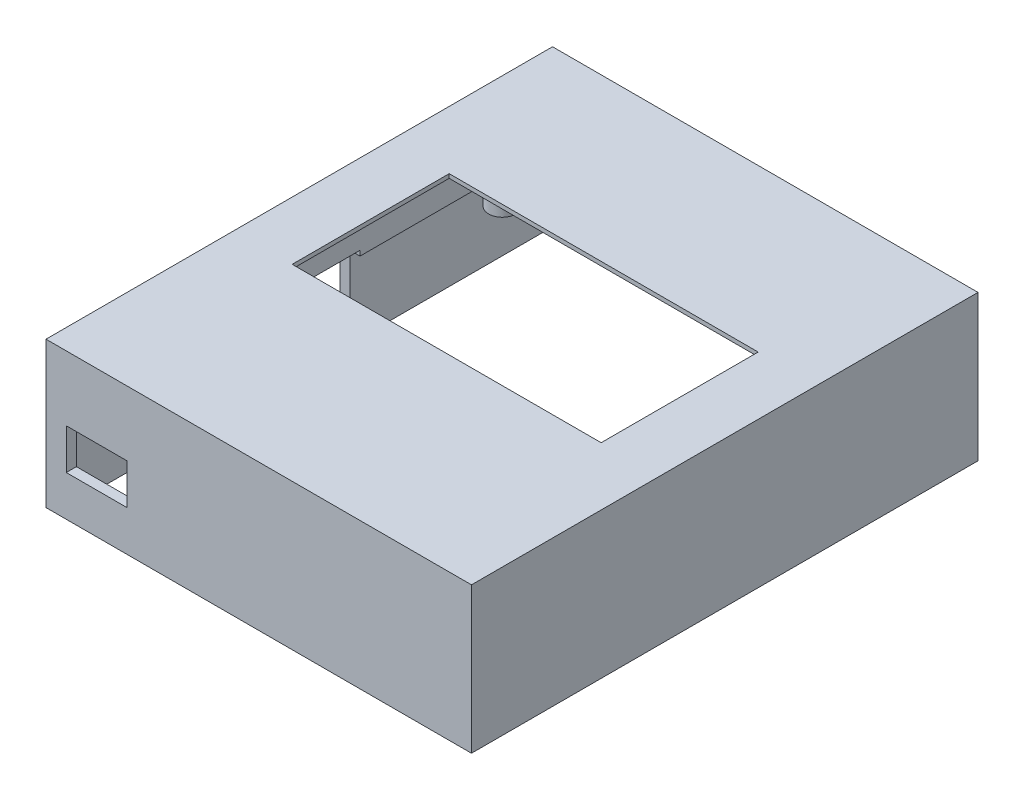
ISO-10303-21;
HEADER;
FILE_DESCRIPTION(('STEP AP214'),'2;1');
FILE_NAME('part.step','',(''),(''),'','','');
FILE_SCHEMA(('AUTOMOTIVE_DESIGN { 1 0 10303 214 1 1 1 1 }'));
ENDSEC;
DATA;
#1=APPLICATION_CONTEXT('core data for automotive mechanical design processes');
#2=APPLICATION_PROTOCOL_DEFINITION('international standard','automotive_design',2000,#1);
#3=PRODUCT_CONTEXT('',#1,'mechanical');
#4=PRODUCT('Part','Part','',(#3));
#5=PRODUCT_RELATED_PRODUCT_CATEGORY('part','',(#4));
#6=PRODUCT_DEFINITION_FORMATION('','',#4);
#7=PRODUCT_DEFINITION_CONTEXT('part definition',#1,'design');
#8=PRODUCT_DEFINITION('design','',#6,#7);
#9=PRODUCT_DEFINITION_SHAPE('','',#8);
#10=(LENGTH_UNIT() NAMED_UNIT(*) SI_UNIT(.MILLI.,.METRE.));
#11=(NAMED_UNIT(*) PLANE_ANGLE_UNIT() SI_UNIT($,.RADIAN.));
#12=(NAMED_UNIT(*) SI_UNIT($,.STERADIAN.) SOLID_ANGLE_UNIT());
#13=UNCERTAINTY_MEASURE_WITH_UNIT(LENGTH_MEASURE(1.E-05),#10,'distance_accuracy_value','');
#14=(GEOMETRIC_REPRESENTATION_CONTEXT(3) GLOBAL_UNCERTAINTY_ASSIGNED_CONTEXT((#13)) GLOBAL_UNIT_ASSIGNED_CONTEXT((#10,
#11,#12)) REPRESENTATION_CONTEXT('',''));
#15=CARTESIAN_POINT('',(0.,0.,0.));
#16=DIRECTION('',(0.,0.,1.));
#17=DIRECTION('',(1.,0.,0.));
#18=AXIS2_PLACEMENT_3D('',#15,#16,#17);
#19=CARTESIAN_POINT('',(0.,-6.,0.));
#20=DIRECTION('',(0.,-1.,0.));
#21=DIRECTION('',(0.,0.,-1.));
#22=AXIS2_PLACEMENT_3D('',#19,#20,#21);
#23=PLANE('',#22);
#24=DIRECTION('',(-1.,0.,0.));
#25=VECTOR('',#24,1.);
#26=CARTESIAN_POINT('',(21.001,-6.,-4.00000000000001));
#27=LINE('',#26,#25);
#28=CARTESIAN_POINT('',(-19.,-6.,-4.));
#29=VERTEX_POINT('',#28);
#30=CARTESIAN_POINT('',(-20.,-6.,-4.));
#31=VERTEX_POINT('',#30);
#32=EDGE_CURVE('E235',#29,#31,#27,.T.);
#33=ORIENTED_EDGE('',*,*,#32,.T.);
#34=DIRECTION('',(0.,0.,-1.));
#35=VECTOR('',#34,1.);
#36=CARTESIAN_POINT('',(-20.,-6.,18.1));
#37=LINE('',#36,#35);
#38=CARTESIAN_POINT('',(-20.,-6.,-24.));
#39=VERTEX_POINT('',#38);
#40=EDGE_CURVE('E315',#31,#39,#37,.T.);
#41=ORIENTED_EDGE('',*,*,#40,.T.);
#42=DIRECTION('',(1.,0.,0.));
#43=VECTOR('',#42,1.);
#44=CARTESIAN_POINT('',(-20.,-6.,-24.));
#45=LINE('',#44,#43);
#46=CARTESIAN_POINT('',(-19.,-6.,-24.));
#47=VERTEX_POINT('',#46);
#48=EDGE_CURVE('E314',#39,#47,#45,.T.);
#49=ORIENTED_EDGE('',*,*,#48,.T.);
#50=DIRECTION('',(0.,0.,1.));
#51=VECTOR('',#50,1.);
#52=CARTESIAN_POINT('',(-19.,-6.,18.1));
#53=LINE('',#52,#51);
#54=EDGE_CURVE('E319',#47,#29,#53,.T.);
#55=ORIENTED_EDGE('',*,*,#54,.T.);
#56=EDGE_LOOP('',(#33,#41,#49,#55));
#57=FACE_BOUND('',#56,.T.);
#58=ADVANCED_FACE('F39',(#57),#23,.T.);
#59=CARTESIAN_POINT('',(0.,0.,0.));
#60=DIRECTION('',(0.,1.,0.));
#61=DIRECTION('',(0.,0.,1.));
#62=AXIS2_PLACEMENT_3D('',#59,#60,#61);
#63=PLANE('',#62);
#64=DIRECTION('',(-1.,0.,0.));
#65=VECTOR('',#64,1.);
#66=CARTESIAN_POINT('',(-15.25,0.,6.45));
#67=LINE('',#66,#65);
#68=CARTESIAN_POINT('',(15.25,0.,6.45));
#69=VERTEX_POINT('',#68);
#70=CARTESIAN_POINT('',(-15.25,0.,6.45));
#71=VERTEX_POINT('',#70);
#72=EDGE_CURVE('E381',#69,#71,#67,.T.);
#73=ORIENTED_EDGE('',*,*,#72,.F.);
#74=DIRECTION('',(0.,0.,1.));
#75=VECTOR('',#74,1.);
#76=CARTESIAN_POINT('',(15.25,0.,-9.05));
#77=LINE('',#76,#75);
#78=CARTESIAN_POINT('',(15.25,0.,-9.05));
#79=VERTEX_POINT('',#78);
#80=EDGE_CURVE('E384',#79,#69,#77,.T.);
#81=ORIENTED_EDGE('',*,*,#80,.F.);
#82=DIRECTION('',(1.,0.,0.));
#83=VECTOR('',#82,1.);
#84=CARTESIAN_POINT('',(-15.25,0.,-9.05));
#85=LINE('',#84,#83);
#86=CARTESIAN_POINT('',(-15.25,0.,-9.05));
#87=VERTEX_POINT('',#86);
#88=EDGE_CURVE('E401',#87,#79,#85,.T.);
#89=ORIENTED_EDGE('',*,*,#88,.F.);
#90=DIRECTION('',(0.,0.,-1.));
#91=VECTOR('',#90,1.);
#92=CARTESIAN_POINT('',(-15.25,0.,-9.05));
#93=LINE('',#92,#91);
#94=EDGE_CURVE('E379',#71,#87,#93,.T.);
#95=ORIENTED_EDGE('',*,*,#94,.F.);
#96=EDGE_LOOP('',(#73,#81,#89,#95));
#97=FACE_BOUND('',#96,.T.);
#98=CARTESIAN_POINT('',(-15.25,0.,-14.3));
#99=DIRECTION('',(0.,1.,0.));
#100=DIRECTION('',(0.,0.,1.));
#101=AXIS2_PLACEMENT_3D('',#98,#99,#100);
#102=CIRCLE('',#101,1.35);
#103=CARTESIAN_POINT('',(-15.25,0.,-12.95));
#104=VERTEX_POINT('',#103);
#105=EDGE_CURVE('E11',#104,#104,#102,.F.);
#106=ORIENTED_EDGE('',*,*,#105,.F.);
#107=EDGE_LOOP('',(#106));
#108=FACE_BOUND('',#107,.T.);
#109=CARTESIAN_POINT('',(15.25,0.,14.3));
#110=DIRECTION('',(0.,1.,0.));
#111=DIRECTION('',(0.,0.,1.));
#112=AXIS2_PLACEMENT_3D('',#109,#110,#111);
#113=CIRCLE('',#112,1.35);
#114=CARTESIAN_POINT('',(15.25,0.,15.65));
#115=VERTEX_POINT('',#114);
#116=EDGE_CURVE('E47',#115,#115,#113,.F.);
#117=ORIENTED_EDGE('',*,*,#116,.F.);
#118=EDGE_LOOP('',(#117));
#119=FACE_BOUND('',#118,.T.);
#120=DIRECTION('',(0.,0.,-1.));
#121=VECTOR('',#120,1.);
#122=CARTESIAN_POINT('',(19.,0.,24.));
#123=LINE('',#122,#121);
#124=CARTESIAN_POINT('',(19.,0.,24.));
#125=VERTEX_POINT('',#124);
#126=CARTESIAN_POINT('',(19.,0.,-24.));
#127=VERTEX_POINT('',#126);
#128=EDGE_CURVE('E257',#125,#127,#123,.T.);
#129=ORIENTED_EDGE('',*,*,#128,.F.);
#130=DIRECTION('',(-1.,0.,0.));
#131=VECTOR('',#130,1.);
#132=CARTESIAN_POINT('',(20.,0.,24.));
#133=LINE('',#132,#131);
#134=CARTESIAN_POINT('',(-20.,0.,24.));
#135=VERTEX_POINT('',#134);
#136=EDGE_CURVE('E338',#125,#135,#133,.T.);
#137=ORIENTED_EDGE('',*,*,#136,.T.);
#138=DIRECTION('',(0.,0.,-1.));
#139=VECTOR('',#138,1.);
#140=CARTESIAN_POINT('',(-20.,0.,24.));
#141=LINE('',#140,#139);
#142=CARTESIAN_POINT('',(-20.,0.,18.1));
#143=VERTEX_POINT('',#142);
#144=EDGE_CURVE('E351',#135,#143,#141,.T.);
#145=ORIENTED_EDGE('',*,*,#144,.T.);
#146=DIRECTION('',(-1.,0.,0.));
#147=VECTOR('',#146,1.);
#148=CARTESIAN_POINT('',(-20.,0.,18.1));
#149=LINE('',#148,#147);
#150=CARTESIAN_POINT('',(-19.,0.,18.1));
#151=VERTEX_POINT('',#150);
#152=EDGE_CURVE('E328',#151,#143,#149,.T.);
#153=ORIENTED_EDGE('',*,*,#152,.F.);
#154=DIRECTION('',(0.,0.,1.));
#155=VECTOR('',#154,1.);
#156=CARTESIAN_POINT('',(-19.,0.,18.1));
#157=LINE('',#156,#155);
#158=CARTESIAN_POINT('',(-19.,0.,-24.));
#159=VERTEX_POINT('',#158);
#160=EDGE_CURVE('E310',#159,#151,#157,.T.);
#161=ORIENTED_EDGE('',*,*,#160,.F.);
#162=DIRECTION('',(1.,0.,0.));
#163=VECTOR('',#162,1.);
#164=CARTESIAN_POINT('',(-20.,0.,-24.));
#165=LINE('',#164,#163);
#166=EDGE_CURVE('E342',#159,#127,#165,.T.);
#167=ORIENTED_EDGE('',*,*,#166,.T.);
#168=EDGE_LOOP('',(#129,#137,#145,#153,#161,#167));
#169=FACE_BOUND('',#168,.T.);
#170=ADVANCED_FACE('F437',(#97,#108,#119,#169),#63,.F.);
#171=CARTESIAN_POINT('',(-20.,-14.,-24.));
#172=DIRECTION('',(0.,0.,1.));
#173=DIRECTION('',(1.,0.,0.));
#174=AXIS2_PLACEMENT_3D('',#171,#172,#173);
#175=PLANE('',#174);
#176=DIRECTION('',(1.,0.,0.));
#177=VECTOR('',#176,1.);
#178=CARTESIAN_POINT('',(20.,-6.,-24.));
#179=LINE('',#178,#177);
#180=CARTESIAN_POINT('',(19.,-6.,-24.));
#181=VERTEX_POINT('',#180);
#182=CARTESIAN_POINT('',(20.,-6.,-24.));
#183=VERTEX_POINT('',#182);
#184=EDGE_CURVE('E302',#181,#183,#179,.T.);
#185=ORIENTED_EDGE('',*,*,#184,.F.);
#186=DIRECTION('',(0.,1.,0.));
#187=VECTOR('',#186,1.);
#188=CARTESIAN_POINT('',(19.,-6.,-24.));
#189=LINE('',#188,#187);
#190=EDGE_CURVE('E304',#181,#127,#189,.T.);
#191=ORIENTED_EDGE('',*,*,#190,.T.);
#192=ORIENTED_EDGE('',*,*,#166,.F.);
#193=DIRECTION('',(0.,1.,0.));
#194=VECTOR('',#193,1.);
#195=CARTESIAN_POINT('',(-19.,-6.,-24.));
#196=LINE('',#195,#194);
#197=EDGE_CURVE('E335',#47,#159,#196,.T.);
#198=ORIENTED_EDGE('',*,*,#197,.F.);
#199=ORIENTED_EDGE('',*,*,#48,.F.);
#200=DIRECTION('',(0.,1.,0.));
#201=VECTOR('',#200,1.);
#202=CARTESIAN_POINT('',(-20.,-14.,-24.));
#203=LINE('',#202,#201);
#204=CARTESIAN_POINT('',(-20.,-14.,-24.));
#205=VERTEX_POINT('',#204);
#206=EDGE_CURVE('E358',#205,#39,#203,.T.);
#207=ORIENTED_EDGE('',*,*,#206,.F.);
#208=DIRECTION('',(1.,0.,0.));
#209=VECTOR('',#208,1.);
#210=CARTESIAN_POINT('',(-20.,-14.,-24.));
#211=LINE('',#210,#209);
#212=CARTESIAN_POINT('',(20.,-14.,-24.));
#213=VERTEX_POINT('',#212);
#214=EDGE_CURVE('E347',#205,#213,#211,.T.);
#215=ORIENTED_EDGE('',*,*,#214,.T.);
#216=DIRECTION('',(0.,1.,0.));
#217=VECTOR('',#216,1.);
#218=CARTESIAN_POINT('',(20.,-14.,-24.));
#219=LINE('',#218,#217);
#220=EDGE_CURVE('E349',#213,#183,#219,.T.);
#221=ORIENTED_EDGE('',*,*,#220,.T.);
#222=EDGE_LOOP('',(#185,#191,#192,#198,#199,#207,#215,#221));
#223=FACE_BOUND('',#222,.T.);
#224=ADVANCED_FACE('F440',(#223),#175,.T.);
#225=CARTESIAN_POINT('',(20.,-14.,-24.));
#226=DIRECTION('',(-1.,0.,0.));
#227=DIRECTION('',(0.,0.,1.));
#228=AXIS2_PLACEMENT_3D('',#225,#226,#227);
#229=PLANE('',#228);
#230=DIRECTION('',(0.,1.,0.));
#231=VECTOR('',#230,1.);
#232=CARTESIAN_POINT('',(20.,-14.,24.));
#233=LINE('',#232,#231);
#234=CARTESIAN_POINT('',(20.,-14.,24.));
#235=VERTEX_POINT('',#234);
#236=CARTESIAN_POINT('',(20.,-6.,24.));
#237=VERTEX_POINT('',#236);
#238=EDGE_CURVE('E364',#235,#237,#233,.T.);
#239=ORIENTED_EDGE('',*,*,#238,.T.);
#240=DIRECTION('',(0.,0.,1.));
#241=VECTOR('',#240,1.);
#242=CARTESIAN_POINT('',(20.,-6.,24.));
#243=LINE('',#242,#241);
#244=EDGE_CURVE('E296',#183,#237,#243,.T.);
#245=ORIENTED_EDGE('',*,*,#244,.F.);
#246=ORIENTED_EDGE('',*,*,#220,.F.);
#247=DIRECTION('',(0.,0.,1.));
#248=VECTOR('',#247,1.);
#249=CARTESIAN_POINT('',(20.,-14.,-24.));
#250=LINE('',#249,#248);
#251=EDGE_CURVE('E339',#213,#235,#250,.T.);
#252=ORIENTED_EDGE('',*,*,#251,.T.);
#253=EDGE_LOOP('',(#239,#245,#246,#252));
#254=FACE_BOUND('',#253,.T.);
#255=ADVANCED_FACE('F479',(#254),#229,.T.);
#256=CARTESIAN_POINT('',(20.,-14.,24.));
#257=DIRECTION('',(0.,0.,-1.));
#258=DIRECTION('',(-1.,0.,0.));
#259=AXIS2_PLACEMENT_3D('',#256,#257,#258);
#260=PLANE('',#259);
#261=DIRECTION('',(0.,-1.,0.));
#262=VECTOR('',#261,1.);
#263=CARTESIAN_POINT('',(-19.,-10.,24.));
#264=LINE('',#263,#262);
#265=CARTESIAN_POINT('',(-19.,-6.,24.));
#266=VERTEX_POINT('',#265);
#267=CARTESIAN_POINT('',(-19.,-10.,24.));
#268=VERTEX_POINT('',#267);
#269=EDGE_CURVE('E221',#266,#268,#264,.T.);
#270=ORIENTED_EDGE('',*,*,#269,.T.);
#271=DIRECTION('',(1.,0.,0.));
#272=VECTOR('',#271,1.);
#273=CARTESIAN_POINT('',(-13.,-10.,24.));
#274=LINE('',#273,#272);
#275=CARTESIAN_POINT('',(-13.,-10.,24.));
#276=VERTEX_POINT('',#275);
#277=EDGE_CURVE('E244',#268,#276,#274,.T.);
#278=ORIENTED_EDGE('',*,*,#277,.T.);
#279=DIRECTION('',(0.,1.,0.));
#280=VECTOR('',#279,1.);
#281=CARTESIAN_POINT('',(-13.,-10.,24.));
#282=LINE('',#281,#280);
#283=CARTESIAN_POINT('',(-13.,-6.,24.));
#284=VERTEX_POINT('',#283);
#285=EDGE_CURVE('E224',#276,#284,#282,.T.);
#286=ORIENTED_EDGE('',*,*,#285,.T.);
#287=DIRECTION('',(-1.,0.,0.));
#288=VECTOR('',#287,1.);
#289=CARTESIAN_POINT('',(-13.,-6.,24.));
#290=LINE('',#289,#288);
#291=EDGE_CURVE('E225',#284,#266,#290,.T.);
#292=ORIENTED_EDGE('',*,*,#291,.T.);
#293=EDGE_LOOP('',(#270,#278,#286,#292));
#294=FACE_BOUND('',#293,.T.);
#295=ORIENTED_EDGE('',*,*,#136,.F.);
#296=DIRECTION('',(0.,1.,0.));
#297=VECTOR('',#296,1.);
#298=CARTESIAN_POINT('',(19.,-6.,24.));
#299=LINE('',#298,#297);
#300=CARTESIAN_POINT('',(19.,-6.,24.));
#301=VERTEX_POINT('',#300);
#302=EDGE_CURVE('E308',#301,#125,#299,.T.);
#303=ORIENTED_EDGE('',*,*,#302,.F.);
#304=DIRECTION('',(-1.,0.,0.));
#305=VECTOR('',#304,1.);
#306=CARTESIAN_POINT('',(20.,-6.,24.));
#307=LINE('',#306,#305);
#308=EDGE_CURVE('E298',#237,#301,#307,.T.);
#309=ORIENTED_EDGE('',*,*,#308,.F.);
#310=ORIENTED_EDGE('',*,*,#238,.F.);
#311=DIRECTION('',(-1.,0.,0.));
#312=VECTOR('',#311,1.);
#313=CARTESIAN_POINT('',(20.,-14.,24.));
#314=LINE('',#313,#312);
#315=CARTESIAN_POINT('',(-20.,-14.,24.));
#316=VERTEX_POINT('',#315);
#317=EDGE_CURVE('E341',#235,#316,#314,.T.);
#318=ORIENTED_EDGE('',*,*,#317,.T.);
#319=DIRECTION('',(0.,1.,0.));
#320=VECTOR('',#319,1.);
#321=CARTESIAN_POINT('',(-20.,-14.,24.));
#322=LINE('',#321,#320);
#323=EDGE_CURVE('E361',#316,#135,#322,.T.);
#324=ORIENTED_EDGE('',*,*,#323,.T.);
#325=EDGE_LOOP('',(#295,#303,#309,#310,#318,#324));
#326=FACE_BOUND('',#325,.T.);
#327=ADVANCED_FACE('F450',(#294,#326),#260,.T.);
#328=CARTESIAN_POINT('',(-20.,-14.,24.));
#329=DIRECTION('',(1.,0.,0.));
#330=DIRECTION('',(0.,0.,-1.));
#331=AXIS2_PLACEMENT_3D('',#328,#329,#330);
#332=PLANE('',#331);
#333=DIRECTION('',(0.,-1.,0.));
#334=VECTOR('',#333,1.);
#335=CARTESIAN_POINT('',(-20.,-11.5,-4.));
#336=LINE('',#335,#334);
#337=CARTESIAN_POINT('',(-20.,-11.5,-4.00000000000001));
#338=VERTEX_POINT('',#337);
#339=EDGE_CURVE('E284',#31,#338,#336,.T.);
#340=ORIENTED_EDGE('',*,*,#339,.T.);
#341=DIRECTION('',(0.,0.,1.));
#342=VECTOR('',#341,1.);
#343=CARTESIAN_POINT('',(-20.,-11.5,8.99999999999999));
#344=LINE('',#343,#342);
#345=CARTESIAN_POINT('',(-20.,-11.5,9.));
#346=VERTEX_POINT('',#345);
#347=EDGE_CURVE('E264',#338,#346,#344,.T.);
#348=ORIENTED_EDGE('',*,*,#347,.T.);
#349=DIRECTION('',(0.,1.,0.));
#350=VECTOR('',#349,1.);
#351=CARTESIAN_POINT('',(-20.,-11.5,9.));
#352=LINE('',#351,#350);
#353=CARTESIAN_POINT('',(-20.,-6.,9.));
#354=VERTEX_POINT('',#353);
#355=EDGE_CURVE('E263',#346,#354,#352,.T.);
#356=ORIENTED_EDGE('',*,*,#355,.T.);
#357=CARTESIAN_POINT('',(-20.,-6.,18.1));
#358=VERTEX_POINT('',#357);
#359=EDGE_CURVE('E311',#358,#354,#37,.T.);
#360=ORIENTED_EDGE('',*,*,#359,.F.);
#361=DIRECTION('',(0.,1.,0.));
#362=VECTOR('',#361,1.);
#363=CARTESIAN_POINT('',(-20.,-6.,18.1));
#364=LINE('',#363,#362);
#365=EDGE_CURVE('E325',#358,#143,#364,.T.);
#366=ORIENTED_EDGE('',*,*,#365,.T.);
#367=ORIENTED_EDGE('',*,*,#144,.F.);
#368=ORIENTED_EDGE('',*,*,#323,.F.);
#369=DIRECTION('',(0.,0.,-1.));
#370=VECTOR('',#369,1.);
#371=CARTESIAN_POINT('',(-20.,-14.,24.));
#372=LINE('',#371,#370);
#373=EDGE_CURVE('E344',#316,#205,#372,.T.);
#374=ORIENTED_EDGE('',*,*,#373,.T.);
#375=ORIENTED_EDGE('',*,*,#206,.T.);
#376=ORIENTED_EDGE('',*,*,#40,.F.);
#377=EDGE_LOOP('',(#340,#348,#356,#360,#366,#367,#368,#374,#375,#376));
#378=FACE_BOUND('',#377,.T.);
#379=ADVANCED_FACE('F458',(#378),#332,.T.);
#380=CARTESIAN_POINT('',(21.,0.4,-25.));
#381=DIRECTION('',(-1.,0.,0.));
#382=DIRECTION('',(0.,0.,1.));
#383=AXIS2_PLACEMENT_3D('',#380,#381,#382);
#384=PLANE('',#383);
#385=DIRECTION('',(0.,-1.,0.));
#386=VECTOR('',#385,1.);
#387=CARTESIAN_POINT('',(21.,0.4,25.));
#388=LINE('',#387,#386);
#389=CARTESIAN_POINT('',(21.,0.4,25.));
#390=VERTEX_POINT('',#389);
#391=CARTESIAN_POINT('',(21.,-14.,25.));
#392=VERTEX_POINT('',#391);
#393=EDGE_CURVE('E425',#390,#392,#388,.T.);
#394=ORIENTED_EDGE('',*,*,#393,.T.);
#395=DIRECTION('',(0.,0.,1.));
#396=VECTOR('',#395,1.);
#397=CARTESIAN_POINT('',(21.,-14.,-25.));
#398=LINE('',#397,#396);
#399=CARTESIAN_POINT('',(21.,-14.,-25.));
#400=VERTEX_POINT('',#399);
#401=EDGE_CURVE('E370',#400,#392,#398,.T.);
#402=ORIENTED_EDGE('',*,*,#401,.F.);
#403=DIRECTION('',(0.,-1.,0.));
#404=VECTOR('',#403,1.);
#405=CARTESIAN_POINT('',(21.,0.4,-25.));
#406=LINE('',#405,#404);
#407=CARTESIAN_POINT('',(21.,0.4,-25.));
#408=VERTEX_POINT('',#407);
#409=EDGE_CURVE('E431',#408,#400,#406,.T.);
#410=ORIENTED_EDGE('',*,*,#409,.F.);
#411=DIRECTION('',(0.,0.,-1.));
#412=VECTOR('',#411,1.);
#413=CARTESIAN_POINT('',(21.,0.4,-25.));
#414=LINE('',#413,#412);
#415=EDGE_CURVE('E416',#390,#408,#414,.T.);
#416=ORIENTED_EDGE('',*,*,#415,.F.);
#417=EDGE_LOOP('',(#394,#402,#410,#416));
#418=FACE_BOUND('',#417,.T.);
#419=ADVANCED_FACE('F41',(#418),#384,.F.);
#420=CARTESIAN_POINT('',(-21.,0.4,-25.));
#421=DIRECTION('',(0.,0.,1.));
#422=DIRECTION('',(1.,0.,0.));
#423=AXIS2_PLACEMENT_3D('',#420,#421,#422);
#424=PLANE('',#423);
#425=ORIENTED_EDGE('',*,*,#409,.T.);
#426=DIRECTION('',(1.,0.,0.));
#427=VECTOR('',#426,1.);
#428=CARTESIAN_POINT('',(-21.,-14.,-25.));
#429=LINE('',#428,#427);
#430=CARTESIAN_POINT('',(-21.,-14.,-25.));
#431=VERTEX_POINT('',#430);
#432=EDGE_CURVE('E367',#431,#400,#429,.T.);
#433=ORIENTED_EDGE('',*,*,#432,.F.);
#434=DIRECTION('',(0.,-1.,0.));
#435=VECTOR('',#434,1.);
#436=CARTESIAN_POINT('',(-21.,0.4,-25.));
#437=LINE('',#436,#435);
#438=CARTESIAN_POINT('',(-21.,0.4,-25.));
#439=VERTEX_POINT('',#438);
#440=EDGE_CURVE('E429',#439,#431,#437,.T.);
#441=ORIENTED_EDGE('',*,*,#440,.F.);
#442=DIRECTION('',(-1.,0.,0.));
#443=VECTOR('',#442,1.);
#444=CARTESIAN_POINT('',(-21.,0.4,-25.));
#445=LINE('',#444,#443);
#446=EDGE_CURVE('E419',#408,#439,#445,.T.);
#447=ORIENTED_EDGE('',*,*,#446,.F.);
#448=EDGE_LOOP('',(#425,#433,#441,#447));
#449=FACE_BOUND('',#448,.T.);
#450=ADVANCED_FACE('F583',(#449),#424,.F.);
#451=CARTESIAN_POINT('',(-21.,0.4,-25.));
#452=DIRECTION('',(1.,0.,0.));
#453=DIRECTION('',(0.,0.,-1.));
#454=AXIS2_PLACEMENT_3D('',#451,#452,#453);
#455=PLANE('',#454);
#456=DIRECTION('',(0.,0.,1.));
#457=VECTOR('',#456,1.);
#458=CARTESIAN_POINT('',(-21.,-11.5,9.));
#459=LINE('',#458,#457);
#460=CARTESIAN_POINT('',(-21.,-11.5,-4.));
#461=VERTEX_POINT('',#460);
#462=CARTESIAN_POINT('',(-21.,-11.5,9.));
#463=VERTEX_POINT('',#462);
#464=EDGE_CURVE('E275',#461,#463,#459,.T.);
#465=ORIENTED_EDGE('',*,*,#464,.F.);
#466=DIRECTION('',(0.,-1.,0.));
#467=VECTOR('',#466,1.);
#468=CARTESIAN_POINT('',(-21.,-11.5,-4.));
#469=LINE('',#468,#467);
#470=CARTESIAN_POINT('',(-21.,-5.5,-4.));
#471=VERTEX_POINT('',#470);
#472=EDGE_CURVE('E278',#471,#461,#469,.T.);
#473=ORIENTED_EDGE('',*,*,#472,.F.);
#474=DIRECTION('',(0.,0.,-1.));
#475=VECTOR('',#474,1.);
#476=CARTESIAN_POINT('',(-21.,-5.5,9.));
#477=LINE('',#476,#475);
#478=CARTESIAN_POINT('',(-21.,-5.5,9.));
#479=VERTEX_POINT('',#478);
#480=EDGE_CURVE('E268',#479,#471,#477,.T.);
#481=ORIENTED_EDGE('',*,*,#480,.F.);
#482=DIRECTION('',(0.,1.,0.));
#483=VECTOR('',#482,1.);
#484=CARTESIAN_POINT('',(-21.,-11.5,9.));
#485=LINE('',#484,#483);
#486=EDGE_CURVE('E272',#463,#479,#485,.T.);
#487=ORIENTED_EDGE('',*,*,#486,.F.);
#488=EDGE_LOOP('',(#465,#473,#481,#487));
#489=FACE_BOUND('',#488,.T.);
#490=ORIENTED_EDGE('',*,*,#440,.T.);
#491=DIRECTION('',(0.,0.,-1.));
#492=VECTOR('',#491,1.);
#493=CARTESIAN_POINT('',(-21.,-14.,25.));
#494=LINE('',#493,#492);
#495=CARTESIAN_POINT('',(-21.,-14.,25.));
#496=VERTEX_POINT('',#495);
#497=EDGE_CURVE('E376',#496,#431,#494,.T.);
#498=ORIENTED_EDGE('',*,*,#497,.F.);
#499=DIRECTION('',(0.,-1.,0.));
#500=VECTOR('',#499,1.);
#501=CARTESIAN_POINT('',(-21.,0.4,25.));
#502=LINE('',#501,#500);
#503=CARTESIAN_POINT('',(-21.,0.4,25.));
#504=VERTEX_POINT('',#503);
#505=EDGE_CURVE('E427',#504,#496,#502,.T.);
#506=ORIENTED_EDGE('',*,*,#505,.F.);
#507=DIRECTION('',(0.,0.,1.));
#508=VECTOR('',#507,1.);
#509=CARTESIAN_POINT('',(-21.,0.4,-25.));
#510=LINE('',#509,#508);
#511=EDGE_CURVE('E421',#439,#504,#510,.T.);
#512=ORIENTED_EDGE('',*,*,#511,.F.);
#513=EDGE_LOOP('',(#490,#498,#506,#512));
#514=FACE_BOUND('',#513,.T.);
#515=ADVANCED_FACE('F499',(#489,#514),#455,.F.);
#516=CARTESIAN_POINT('',(-21.,0.4,25.));
#517=DIRECTION('',(0.,0.,-1.));
#518=DIRECTION('',(-1.,0.,0.));
#519=AXIS2_PLACEMENT_3D('',#516,#517,#518);
#520=PLANE('',#519);
#521=DIRECTION('',(1.,0.,0.));
#522=VECTOR('',#521,1.);
#523=CARTESIAN_POINT('',(-13.,-10.,25.));
#524=LINE('',#523,#522);
#525=CARTESIAN_POINT('',(-19.,-10.,25.));
#526=VERTEX_POINT('',#525);
#527=CARTESIAN_POINT('',(-13.,-10.,25.));
#528=VERTEX_POINT('',#527);
#529=EDGE_CURVE('E241',#526,#528,#524,.T.);
#530=ORIENTED_EDGE('',*,*,#529,.F.);
#531=DIRECTION('',(0.,-1.,0.));
#532=VECTOR('',#531,1.);
#533=CARTESIAN_POINT('',(-19.,-10.,25.));
#534=LINE('',#533,#532);
#535=CARTESIAN_POINT('',(-19.,-6.,25.));
#536=VERTEX_POINT('',#535);
#537=EDGE_CURVE('E62',#536,#526,#534,.T.);
#538=ORIENTED_EDGE('',*,*,#537,.F.);
#539=DIRECTION('',(-1.,0.,0.));
#540=VECTOR('',#539,1.);
#541=CARTESIAN_POINT('',(-13.,-6.,25.));
#542=LINE('',#541,#540);
#543=CARTESIAN_POINT('',(-13.,-6.,25.));
#544=VERTEX_POINT('',#543);
#545=EDGE_CURVE('E228',#544,#536,#542,.T.);
#546=ORIENTED_EDGE('',*,*,#545,.F.);
#547=DIRECTION('',(0.,1.,0.));
#548=VECTOR('',#547,1.);
#549=CARTESIAN_POINT('',(-13.,-10.,25.));
#550=LINE('',#549,#548);
#551=EDGE_CURVE('E236',#528,#544,#550,.T.);
#552=ORIENTED_EDGE('',*,*,#551,.F.);
#553=EDGE_LOOP('',(#530,#538,#546,#552));
#554=FACE_BOUND('',#553,.T.);
#555=ORIENTED_EDGE('',*,*,#505,.T.);
#556=DIRECTION('',(-1.,0.,0.));
#557=VECTOR('',#556,1.);
#558=CARTESIAN_POINT('',(21.,-14.,25.));
#559=LINE('',#558,#557);
#560=EDGE_CURVE('E373',#392,#496,#559,.T.);
#561=ORIENTED_EDGE('',*,*,#560,.F.);
#562=ORIENTED_EDGE('',*,*,#393,.F.);
#563=DIRECTION('',(1.,0.,0.));
#564=VECTOR('',#563,1.);
#565=CARTESIAN_POINT('',(-21.,0.4,25.));
#566=LINE('',#565,#564);
#567=EDGE_CURVE('E423',#504,#390,#566,.T.);
#568=ORIENTED_EDGE('',*,*,#567,.F.);
#569=EDGE_LOOP('',(#555,#561,#562,#568));
#570=FACE_BOUND('',#569,.T.);
#571=ADVANCED_FACE('F239',(#554,#570),#520,.F.);
#572=CARTESIAN_POINT('',(0.,0.4,0.));
#573=DIRECTION('',(0.,1.,0.));
#574=DIRECTION('',(0.,0.,1.));
#575=AXIS2_PLACEMENT_3D('',#572,#573,#574);
#576=PLANE('',#575);
#577=DIRECTION('',(0.,0.,-1.));
#578=VECTOR('',#577,1.);
#579=CARTESIAN_POINT('',(15.25,0.4,-9.05));
#580=LINE('',#579,#578);
#581=CARTESIAN_POINT('',(15.25,0.4,6.45));
#582=VERTEX_POINT('',#581);
#583=CARTESIAN_POINT('',(15.25,0.4,-9.05));
#584=VERTEX_POINT('',#583);
#585=EDGE_CURVE('E387',#582,#584,#580,.T.);
#586=ORIENTED_EDGE('',*,*,#585,.F.);
#587=DIRECTION('',(1.,0.,0.));
#588=VECTOR('',#587,1.);
#589=CARTESIAN_POINT('',(-15.25,0.4,6.45));
#590=LINE('',#589,#588);
#591=CARTESIAN_POINT('',(-15.25,0.4,6.45));
#592=VERTEX_POINT('',#591);
#593=EDGE_CURVE('E395',#592,#582,#590,.T.);
#594=ORIENTED_EDGE('',*,*,#593,.F.);
#595=DIRECTION('',(0.,0.,1.));
#596=VECTOR('',#595,1.);
#597=CARTESIAN_POINT('',(-15.25,0.4,-9.05));
#598=LINE('',#597,#596);
#599=CARTESIAN_POINT('',(-15.25,0.4,-9.05));
#600=VERTEX_POINT('',#599);
#601=EDGE_CURVE('E392',#600,#592,#598,.T.);
#602=ORIENTED_EDGE('',*,*,#601,.F.);
#603=DIRECTION('',(-1.,0.,0.));
#604=VECTOR('',#603,1.);
#605=CARTESIAN_POINT('',(-15.25,0.4,-9.05));
#606=LINE('',#605,#604);
#607=EDGE_CURVE('E389',#584,#600,#606,.T.);
#608=ORIENTED_EDGE('',*,*,#607,.F.);
#609=EDGE_LOOP('',(#586,#594,#602,#608));
#610=FACE_BOUND('',#609,.T.);
#611=ORIENTED_EDGE('',*,*,#415,.T.);
#612=ORIENTED_EDGE('',*,*,#446,.T.);
#613=ORIENTED_EDGE('',*,*,#511,.T.);
#614=ORIENTED_EDGE('',*,*,#567,.T.);
#615=EDGE_LOOP('',(#611,#612,#613,#614));
#616=FACE_BOUND('',#615,.T.);
#617=ADVANCED_FACE('F575',(#610,#616),#576,.T.);
#618=CARTESIAN_POINT('',(15.25,-5.,14.3));
#619=DIRECTION('',(0.,1.,0.));
#620=DIRECTION('',(0.,0.,1.));
#621=AXIS2_PLACEMENT_3D('',#618,#619,#620);
#622=CYLINDRICAL_SURFACE('',#621,1.35);
#623=CARTESIAN_POINT('',(15.25,-5.,14.3));
#624=DIRECTION('',(0.,-1.,0.));
#625=DIRECTION('',(0.,0.,-1.));
#626=AXIS2_PLACEMENT_3D('',#623,#624,#625);
#627=CIRCLE('',#626,1.35);
#628=CARTESIAN_POINT('',(15.25,-5.,12.95));
#629=VERTEX_POINT('',#628);
#630=EDGE_CURVE('E413',#629,#629,#627,.T.);
#631=ORIENTED_EDGE('',*,*,#630,.F.);
#632=EDGE_LOOP('',(#631));
#633=FACE_BOUND('',#632,.T.);
#634=ORIENTED_EDGE('',*,*,#116,.T.);
#635=EDGE_LOOP('',(#634));
#636=FACE_BOUND('',#635,.T.);
#637=ADVANCED_FACE('F435',(#633,#636),#622,.T.);
#638=CARTESIAN_POINT('',(15.25,-5.,14.3));
#639=DIRECTION('',(0.,-1.,0.));
#640=DIRECTION('',(0.,0.,-1.));
#641=AXIS2_PLACEMENT_3D('',#638,#639,#640);
#642=PLANE('',#641);
#643=ORIENTED_EDGE('',*,*,#630,.T.);
#644=EDGE_LOOP('',(#643));
#645=FACE_BOUND('',#644,.T.);
#646=ADVANCED_FACE('F568',(#645),#642,.T.);
#647=CARTESIAN_POINT('',(-15.25,-5.,-14.3));
#648=DIRECTION('',(0.,1.,0.));
#649=DIRECTION('',(0.,0.,1.));
#650=AXIS2_PLACEMENT_3D('',#647,#648,#649);
#651=CYLINDRICAL_SURFACE('',#650,1.35);
#652=CARTESIAN_POINT('',(-15.25,-5.,-14.3));
#653=DIRECTION('',(0.,-1.,0.));
#654=DIRECTION('',(0.,0.,-1.));
#655=AXIS2_PLACEMENT_3D('',#652,#653,#654);
#656=CIRCLE('',#655,1.35);
#657=CARTESIAN_POINT('',(-15.25,-5.,-15.65));
#658=VERTEX_POINT('',#657);
#659=EDGE_CURVE('E410',#658,#658,#656,.T.);
#660=ORIENTED_EDGE('',*,*,#659,.F.);
#661=EDGE_LOOP('',(#660));
#662=FACE_BOUND('',#661,.T.);
#663=ORIENTED_EDGE('',*,*,#105,.T.);
#664=EDGE_LOOP('',(#663));
#665=FACE_BOUND('',#664,.T.);
#666=ADVANCED_FACE('F564',(#662,#665),#651,.T.);
#667=CARTESIAN_POINT('',(-15.25,-5.,-14.3));
#668=DIRECTION('',(0.,-1.,0.));
#669=DIRECTION('',(0.,0.,-1.));
#670=AXIS2_PLACEMENT_3D('',#667,#668,#669);
#671=PLANE('',#670);
#672=ORIENTED_EDGE('',*,*,#659,.T.);
#673=EDGE_LOOP('',(#672));
#674=FACE_BOUND('',#673,.T.);
#675=ADVANCED_FACE('F560',(#674),#671,.T.);
#676=CARTESIAN_POINT('',(15.25,-5.001,-9.05));
#677=DIRECTION('',(1.,0.,0.));
#678=DIRECTION('',(0.,0.,-1.));
#679=AXIS2_PLACEMENT_3D('',#676,#677,#678);
#680=PLANE('',#679);
#681=ORIENTED_EDGE('',*,*,#80,.T.);
#682=DIRECTION('',(0.,1.,0.));
#683=VECTOR('',#682,1.);
#684=CARTESIAN_POINT('',(15.25,-5.001,6.45));
#685=LINE('',#684,#683);
#686=EDGE_CURVE('E399',#69,#582,#685,.T.);
#687=ORIENTED_EDGE('',*,*,#686,.T.);
#688=ORIENTED_EDGE('',*,*,#585,.T.);
#689=DIRECTION('',(0.,1.,0.));
#690=VECTOR('',#689,1.);
#691=CARTESIAN_POINT('',(15.25,-5.001,-9.05));
#692=LINE('',#691,#690);
#693=EDGE_CURVE('E398',#79,#584,#692,.T.);
#694=ORIENTED_EDGE('',*,*,#693,.F.);
#695=EDGE_LOOP('',(#681,#687,#688,#694));
#696=FACE_BOUND('',#695,.T.);
#697=ADVANCED_FACE('F550',(#696),#680,.F.);
#698=CARTESIAN_POINT('',(-15.25,-5.001,6.45));
#699=DIRECTION('',(0.,0.,1.));
#700=DIRECTION('',(1.,0.,0.));
#701=AXIS2_PLACEMENT_3D('',#698,#699,#700);
#702=PLANE('',#701);
#703=ORIENTED_EDGE('',*,*,#72,.T.);
#704=DIRECTION('',(0.,1.,0.));
#705=VECTOR('',#704,1.);
#706=CARTESIAN_POINT('',(-15.25,-5.001,6.45));
#707=LINE('',#706,#705);
#708=EDGE_CURVE('E402',#71,#592,#707,.T.);
#709=ORIENTED_EDGE('',*,*,#708,.T.);
#710=ORIENTED_EDGE('',*,*,#593,.T.);
#711=ORIENTED_EDGE('',*,*,#686,.F.);
#712=EDGE_LOOP('',(#703,#709,#710,#711));
#713=FACE_BOUND('',#712,.T.);
#714=ADVANCED_FACE('F546',(#713),#702,.F.);
#715=CARTESIAN_POINT('',(-15.25,-5.001,-9.05));
#716=DIRECTION('',(-1.,0.,0.));
#717=DIRECTION('',(0.,0.,1.));
#718=AXIS2_PLACEMENT_3D('',#715,#716,#717);
#719=PLANE('',#718);
#720=ORIENTED_EDGE('',*,*,#94,.T.);
#721=DIRECTION('',(0.,1.,0.));
#722=VECTOR('',#721,1.);
#723=CARTESIAN_POINT('',(-15.25,-5.001,-9.05));
#724=LINE('',#723,#722);
#725=EDGE_CURVE('E404',#87,#600,#724,.T.);
#726=ORIENTED_EDGE('',*,*,#725,.T.);
#727=ORIENTED_EDGE('',*,*,#601,.T.);
#728=ORIENTED_EDGE('',*,*,#708,.F.);
#729=EDGE_LOOP('',(#720,#726,#727,#728));
#730=FACE_BOUND('',#729,.T.);
#731=ADVANCED_FACE('F549',(#730),#719,.F.);
#732=CARTESIAN_POINT('',(-15.25,-5.001,-9.05));
#733=DIRECTION('',(0.,0.,-1.));
#734=DIRECTION('',(-1.,0.,0.));
#735=AXIS2_PLACEMENT_3D('',#732,#733,#734);
#736=PLANE('',#735);
#737=ORIENTED_EDGE('',*,*,#88,.T.);
#738=ORIENTED_EDGE('',*,*,#693,.T.);
#739=ORIENTED_EDGE('',*,*,#607,.T.);
#740=ORIENTED_EDGE('',*,*,#725,.F.);
#741=EDGE_LOOP('',(#737,#738,#739,#740));
#742=FACE_BOUND('',#741,.T.);
#743=ADVANCED_FACE('F544',(#742),#736,.F.);
#744=CARTESIAN_POINT('',(0.,-14.,0.));
#745=DIRECTION('',(0.,-1.,0.));
#746=DIRECTION('',(0.,0.,-1.));
#747=AXIS2_PLACEMENT_3D('',#744,#745,#746);
#748=PLANE('',#747);
#749=ORIENTED_EDGE('',*,*,#432,.T.);
#750=ORIENTED_EDGE('',*,*,#401,.T.);
#751=ORIENTED_EDGE('',*,*,#560,.T.);
#752=ORIENTED_EDGE('',*,*,#497,.T.);
#753=EDGE_LOOP('',(#749,#750,#751,#752));
#754=FACE_BOUND('',#753,.T.);
#755=ORIENTED_EDGE('',*,*,#317,.F.);
#756=ORIENTED_EDGE('',*,*,#251,.F.);
#757=ORIENTED_EDGE('',*,*,#214,.F.);
#758=ORIENTED_EDGE('',*,*,#373,.F.);
#759=EDGE_LOOP('',(#755,#756,#757,#758));
#760=FACE_BOUND('',#759,.T.);
#761=ADVANCED_FACE('F484',(#754,#760),#748,.T.);
#762=CARTESIAN_POINT('',(-19.,-6.,18.1));
#763=DIRECTION('',(-1.,0.,0.));
#764=DIRECTION('',(0.,0.,1.));
#765=AXIS2_PLACEMENT_3D('',#762,#763,#764);
#766=PLANE('',#765);
#767=DIRECTION('',(0.,0.,1.));
#768=VECTOR('',#767,1.);
#769=CARTESIAN_POINT('',(-19.,-5.5,8.99999999999999));
#770=LINE('',#769,#768);
#771=CARTESIAN_POINT('',(-19.,-5.5,-4.00000000000001));
#772=VERTEX_POINT('',#771);
#773=CARTESIAN_POINT('',(-19.,-5.5,9.));
#774=VERTEX_POINT('',#773);
#775=EDGE_CURVE('E258',#772,#774,#770,.T.);
#776=ORIENTED_EDGE('',*,*,#775,.F.);
#777=DIRECTION('',(0.,1.,0.));
#778=VECTOR('',#777,1.);
#779=CARTESIAN_POINT('',(-19.,-11.5,-4.));
#780=LINE('',#779,#778);
#781=EDGE_CURVE('E271',#29,#772,#780,.T.);
#782=ORIENTED_EDGE('',*,*,#781,.F.);
#783=ORIENTED_EDGE('',*,*,#54,.F.);
#784=ORIENTED_EDGE('',*,*,#197,.T.);
#785=ORIENTED_EDGE('',*,*,#160,.T.);
#786=DIRECTION('',(0.,1.,0.));
#787=VECTOR('',#786,1.);
#788=CARTESIAN_POINT('',(-19.,-6.,18.1));
#789=LINE('',#788,#787);
#790=CARTESIAN_POINT('',(-19.,-6.,18.1));
#791=VERTEX_POINT('',#790);
#792=EDGE_CURVE('E332',#791,#151,#789,.T.);
#793=ORIENTED_EDGE('',*,*,#792,.F.);
#794=CARTESIAN_POINT('',(-19.,-6.,9.));
#795=VERTEX_POINT('',#794);
#796=EDGE_CURVE('E318',#795,#791,#53,.T.);
#797=ORIENTED_EDGE('',*,*,#796,.F.);
#798=DIRECTION('',(0.,-1.,0.));
#799=VECTOR('',#798,1.);
#800=CARTESIAN_POINT('',(-19.,-11.5,9.));
#801=LINE('',#800,#799);
#802=EDGE_CURVE('E255',#774,#795,#801,.T.);
#803=ORIENTED_EDGE('',*,*,#802,.F.);
#804=EDGE_LOOP('',(#776,#782,#783,#784,#785,#793,#797,#803));
#805=FACE_BOUND('',#804,.T.);
#806=ADVANCED_FACE('F467',(#805),#766,.F.);
#807=CARTESIAN_POINT('',(-20.,-6.,18.1));
#808=DIRECTION('',(0.,0.,-1.));
#809=DIRECTION('',(-1.,0.,0.));
#810=AXIS2_PLACEMENT_3D('',#807,#808,#809);
#811=PLANE('',#810);
#812=ORIENTED_EDGE('',*,*,#152,.T.);
#813=ORIENTED_EDGE('',*,*,#365,.F.);
#814=DIRECTION('',(-1.,0.,0.));
#815=VECTOR('',#814,1.);
#816=CARTESIAN_POINT('',(-20.,-6.,18.1));
#817=LINE('',#816,#815);
#818=EDGE_CURVE('E322',#791,#358,#817,.T.);
#819=ORIENTED_EDGE('',*,*,#818,.F.);
#820=ORIENTED_EDGE('',*,*,#792,.T.);
#821=EDGE_LOOP('',(#812,#813,#819,#820));
#822=FACE_BOUND('',#821,.T.);
#823=ADVANCED_FACE('F461',(#822),#811,.F.);
#824=DIRECTION('',(1.,0.,0.));
#825=VECTOR('',#824,1.);
#826=CARTESIAN_POINT('',(21.001,-6.,9.));
#827=LINE('',#826,#825);
#828=EDGE_CURVE('E259',#354,#795,#827,.T.);
#829=ORIENTED_EDGE('',*,*,#828,.T.);
#830=ORIENTED_EDGE('',*,*,#796,.T.);
#831=ORIENTED_EDGE('',*,*,#818,.T.);
#832=ORIENTED_EDGE('',*,*,#359,.T.);
#833=EDGE_LOOP('',(#829,#830,#831,#832));
#834=FACE_BOUND('',#833,.T.);
#835=ADVANCED_FACE('F507',(#834),#23,.T.);
#836=CARTESIAN_POINT('',(19.,-6.,24.));
#837=DIRECTION('',(1.,0.,0.));
#838=DIRECTION('',(0.,0.,-1.));
#839=AXIS2_PLACEMENT_3D('',#836,#837,#838);
#840=PLANE('',#839);
#841=ORIENTED_EDGE('',*,*,#128,.T.);
#842=ORIENTED_EDGE('',*,*,#190,.F.);
#843=DIRECTION('',(0.,0.,-1.));
#844=VECTOR('',#843,1.);
#845=CARTESIAN_POINT('',(19.,-6.,24.));
#846=LINE('',#845,#844);
#847=EDGE_CURVE('E300',#301,#181,#846,.T.);
#848=ORIENTED_EDGE('',*,*,#847,.F.);
#849=ORIENTED_EDGE('',*,*,#302,.T.);
#850=EDGE_LOOP('',(#841,#842,#848,#849));
#851=FACE_BOUND('',#850,.T.);
#852=ADVANCED_FACE('F474',(#851),#840,.F.);
#853=CARTESIAN_POINT('',(0.,-6.,0.));
#854=DIRECTION('',(0.,1.,0.));
#855=DIRECTION('',(0.,0.,1.));
#856=AXIS2_PLACEMENT_3D('',#853,#854,#855);
#857=PLANE('',#856);
#858=ORIENTED_EDGE('',*,*,#244,.T.);
#859=ORIENTED_EDGE('',*,*,#308,.T.);
#860=ORIENTED_EDGE('',*,*,#847,.T.);
#861=ORIENTED_EDGE('',*,*,#184,.T.);
#862=EDGE_LOOP('',(#858,#859,#860,#861));
#863=FACE_BOUND('',#862,.T.);
#864=ADVANCED_FACE('F476',(#863),#857,.F.);
#865=CARTESIAN_POINT('',(21.001,-11.5,-4.00000000000001));
#866=DIRECTION('',(0.,0.,-1.));
#867=DIRECTION('',(-1.,0.,0.));
#868=AXIS2_PLACEMENT_3D('',#865,#866,#867);
#869=PLANE('',#868);
#870=ORIENTED_EDGE('',*,*,#32,.F.);
#871=ORIENTED_EDGE('',*,*,#781,.T.);
#872=DIRECTION('',(-1.,0.,0.));
#873=VECTOR('',#872,1.);
#874=CARTESIAN_POINT('',(21.001,-5.5,-4.00000000000001));
#875=LINE('',#874,#873);
#876=EDGE_CURVE('E290',#772,#471,#875,.T.);
#877=ORIENTED_EDGE('',*,*,#876,.T.);
#878=ORIENTED_EDGE('',*,*,#472,.T.);
#879=DIRECTION('',(-1.,0.,0.));
#880=VECTOR('',#879,1.);
#881=CARTESIAN_POINT('',(21.001,-11.5,-4.00000000000001));
#882=LINE('',#881,#880);
#883=EDGE_CURVE('E287',#338,#461,#882,.T.);
#884=ORIENTED_EDGE('',*,*,#883,.F.);
#885=ORIENTED_EDGE('',*,*,#339,.F.);
#886=EDGE_LOOP('',(#870,#871,#877,#878,#884,#885));
#887=FACE_BOUND('',#886,.T.);
#888=ADVANCED_FACE('F490',(#887),#869,.F.);
#889=CARTESIAN_POINT('',(21.001,-5.5,9.));
#890=DIRECTION('',(0.,1.,0.));
#891=DIRECTION('',(0.,0.,1.));
#892=AXIS2_PLACEMENT_3D('',#889,#890,#891);
#893=PLANE('',#892);
#894=ORIENTED_EDGE('',*,*,#775,.T.);
#895=DIRECTION('',(-1.,0.,0.));
#896=VECTOR('',#895,1.);
#897=CARTESIAN_POINT('',(21.001,-5.5,9.));
#898=LINE('',#897,#896);
#899=EDGE_CURVE('E262',#774,#479,#898,.T.);
#900=ORIENTED_EDGE('',*,*,#899,.T.);
#901=ORIENTED_EDGE('',*,*,#480,.T.);
#902=ORIENTED_EDGE('',*,*,#876,.F.);
#903=EDGE_LOOP('',(#894,#900,#901,#902));
#904=FACE_BOUND('',#903,.T.);
#905=ADVANCED_FACE('F492',(#904),#893,.F.);
#906=CARTESIAN_POINT('',(21.001,-11.5,8.99999999999999));
#907=DIRECTION('',(0.,0.,1.));
#908=DIRECTION('',(0.,-1.,0.));
#909=AXIS2_PLACEMENT_3D('',#906,#907,#908);
#910=PLANE('',#909);
#911=DIRECTION('',(-1.,0.,0.));
#912=VECTOR('',#911,1.);
#913=CARTESIAN_POINT('',(21.001,-11.5,8.99999999999999));
#914=LINE('',#913,#912);
#915=EDGE_CURVE('E267',#346,#463,#914,.T.);
#916=ORIENTED_EDGE('',*,*,#915,.T.);
#917=ORIENTED_EDGE('',*,*,#486,.T.);
#918=ORIENTED_EDGE('',*,*,#899,.F.);
#919=ORIENTED_EDGE('',*,*,#802,.T.);
#920=ORIENTED_EDGE('',*,*,#828,.F.);
#921=ORIENTED_EDGE('',*,*,#355,.F.);
#922=EDGE_LOOP('',(#916,#917,#918,#919,#920,#921));
#923=FACE_BOUND('',#922,.T.);
#924=ADVANCED_FACE('F508',(#923),#910,.F.);
#925=CARTESIAN_POINT('',(21.001,-11.5,8.99999999999999));
#926=DIRECTION('',(0.,-1.,0.));
#927=DIRECTION('',(0.,0.,-1.));
#928=AXIS2_PLACEMENT_3D('',#925,#926,#927);
#929=PLANE('',#928);
#930=ORIENTED_EDGE('',*,*,#883,.T.);
#931=ORIENTED_EDGE('',*,*,#464,.T.);
#932=ORIENTED_EDGE('',*,*,#915,.F.);
#933=ORIENTED_EDGE('',*,*,#347,.F.);
#934=EDGE_LOOP('',(#930,#931,#932,#933));
#935=FACE_BOUND('',#934,.T.);
#936=ADVANCED_FACE('F503',(#935),#929,.F.);
#937=CARTESIAN_POINT('',(-19.,-10.,-25.001));
#938=DIRECTION('',(-1.,0.,0.));
#939=DIRECTION('',(0.,0.,1.));
#940=AXIS2_PLACEMENT_3D('',#937,#938,#939);
#941=PLANE('',#940);
#942=DIRECTION('',(0.,0.,1.));
#943=VECTOR('',#942,1.);
#944=CARTESIAN_POINT('',(-19.,-6.,-25.001));
#945=LINE('',#944,#943);
#946=EDGE_CURVE('E217',#266,#536,#945,.T.);
#947=ORIENTED_EDGE('',*,*,#946,.T.);
#948=ORIENTED_EDGE('',*,*,#537,.T.);
#949=DIRECTION('',(0.,0.,1.));
#950=VECTOR('',#949,1.);
#951=CARTESIAN_POINT('',(-19.,-10.,-25.001));
#952=LINE('',#951,#950);
#953=EDGE_CURVE('E249',#268,#526,#952,.T.);
#954=ORIENTED_EDGE('',*,*,#953,.F.);
#955=ORIENTED_EDGE('',*,*,#269,.F.);
#956=EDGE_LOOP('',(#947,#948,#954,#955));
#957=FACE_BOUND('',#956,.T.);
#958=ADVANCED_FACE('F219',(#957),#941,.F.);
#959=CARTESIAN_POINT('',(-13.,-6.,-25.001));
#960=DIRECTION('',(0.,1.,0.));
#961=DIRECTION('',(-1.,0.,0.));
#962=AXIS2_PLACEMENT_3D('',#959,#960,#961);
#963=PLANE('',#962);
#964=DIRECTION('',(0.,0.,1.));
#965=VECTOR('',#964,1.);
#966=CARTESIAN_POINT('',(-13.,-6.,-25.001));
#967=LINE('',#966,#965);
#968=EDGE_CURVE('E231',#284,#544,#967,.T.);
#969=ORIENTED_EDGE('',*,*,#968,.T.);
#970=ORIENTED_EDGE('',*,*,#545,.T.);
#971=ORIENTED_EDGE('',*,*,#946,.F.);
#972=ORIENTED_EDGE('',*,*,#291,.F.);
#973=EDGE_LOOP('',(#969,#970,#971,#972));
#974=FACE_BOUND('',#973,.T.);
#975=ADVANCED_FACE('F229',(#974),#963,.F.);
#976=CARTESIAN_POINT('',(-13.,-10.,-25.001));
#977=DIRECTION('',(1.,0.,0.));
#978=DIRECTION('',(0.,0.,-1.));
#979=AXIS2_PLACEMENT_3D('',#976,#977,#978);
#980=PLANE('',#979);
#981=DIRECTION('',(0.,0.,1.));
#982=VECTOR('',#981,1.);
#983=CARTESIAN_POINT('',(-13.,-10.,-25.001));
#984=LINE('',#983,#982);
#985=EDGE_CURVE('E54',#276,#528,#984,.T.);
#986=ORIENTED_EDGE('',*,*,#985,.T.);
#987=ORIENTED_EDGE('',*,*,#551,.T.);
#988=ORIENTED_EDGE('',*,*,#968,.F.);
#989=ORIENTED_EDGE('',*,*,#285,.F.);
#990=EDGE_LOOP('',(#986,#987,#988,#989));
#991=FACE_BOUND('',#990,.T.);
#992=ADVANCED_FACE('F681',(#991),#980,.F.);
#993=CARTESIAN_POINT('',(-13.,-10.,-25.001));
#994=DIRECTION('',(0.,-1.,0.));
#995=DIRECTION('',(1.,0.,0.));
#996=AXIS2_PLACEMENT_3D('',#993,#994,#995);
#997=PLANE('',#996);
#998=ORIENTED_EDGE('',*,*,#953,.T.);
#999=ORIENTED_EDGE('',*,*,#529,.T.);
#1000=ORIENTED_EDGE('',*,*,#985,.F.);
#1001=ORIENTED_EDGE('',*,*,#277,.F.);
#1002=EDGE_LOOP('',(#998,#999,#1000,#1001));
#1003=FACE_BOUND('',#1002,.T.);
#1004=ADVANCED_FACE('F690',(#1003),#997,.F.);
#1005=CLOSED_SHELL('',(#58,#170,#224,#255,#327,#379,#419,#450,#515,#571,#617,#637,#646,#666,
#675,#697,#714,#731,#743,#761,#806,#823,#835,#852,#864,#888,#905,#924,#936,#958,#975,#992,#1004));
#1006=MANIFOLD_SOLID_BREP('B2',#1005);
#1007=ADVANCED_BREP_SHAPE_REPRESENTATION('',(#18,#1006),#14);
#1008=SHAPE_DEFINITION_REPRESENTATION(#9,#1007);
ENDSEC;
END-ISO-10303-21;
